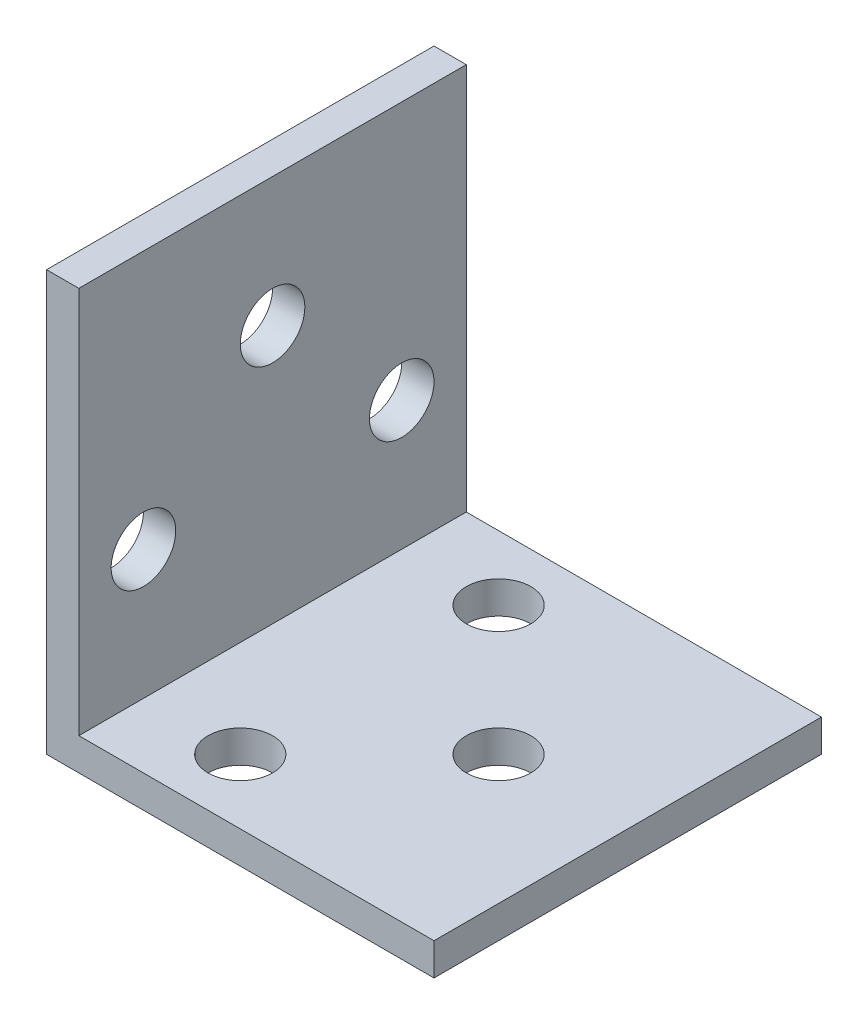
ISO-10303-21;
HEADER;
FILE_DESCRIPTION(('STEP AP214'),'2;1');
FILE_NAME('part.step','',(''),(''),'','','');
FILE_SCHEMA(('AUTOMOTIVE_DESIGN { 1 0 10303 214 1 1 1 1 }'));
ENDSEC;
DATA;
#1=APPLICATION_CONTEXT('core data for automotive mechanical design processes');
#2=APPLICATION_PROTOCOL_DEFINITION('international standard','automotive_design',2000,#1);
#3=PRODUCT_CONTEXT('',#1,'mechanical');
#4=PRODUCT('Part','Part','',(#3));
#5=PRODUCT_RELATED_PRODUCT_CATEGORY('part','',(#4));
#6=PRODUCT_DEFINITION_FORMATION('','',#4);
#7=PRODUCT_DEFINITION_CONTEXT('part definition',#1,'design');
#8=PRODUCT_DEFINITION('design','',#6,#7);
#9=PRODUCT_DEFINITION_SHAPE('','',#8);
#10=(LENGTH_UNIT() NAMED_UNIT(*) SI_UNIT(.MILLI.,.METRE.));
#11=(NAMED_UNIT(*) PLANE_ANGLE_UNIT() SI_UNIT($,.RADIAN.));
#12=(NAMED_UNIT(*) SI_UNIT($,.STERADIAN.) SOLID_ANGLE_UNIT());
#13=UNCERTAINTY_MEASURE_WITH_UNIT(LENGTH_MEASURE(1.E-05),#10,'distance_accuracy_value','');
#14=(GEOMETRIC_REPRESENTATION_CONTEXT(3) GLOBAL_UNCERTAINTY_ASSIGNED_CONTEXT((#13)) GLOBAL_UNIT_ASSIGNED_CONTEXT((#10,
#11,#12)) REPRESENTATION_CONTEXT('',''));
#15=CARTESIAN_POINT('',(0.,0.,0.));
#16=DIRECTION('',(0.,0.,1.));
#17=DIRECTION('',(1.,0.,0.));
#18=AXIS2_PLACEMENT_3D('',#15,#16,#17);
#19=CARTESIAN_POINT('',(3.175,41.275,-38.1));
#20=DIRECTION('',(-1.,0.,0.));
#21=DIRECTION('',(0.,0.,1.));
#22=AXIS2_PLACEMENT_3D('',#19,#20,#21);
#23=PLANE('',#22);
#24=DIRECTION('',(0.,1.,0.));
#25=VECTOR('',#24,1.);
#26=CARTESIAN_POINT('',(3.175,3.175,-38.1));
#27=LINE('',#26,#25);
#28=CARTESIAN_POINT('',(3.175,3.175,-38.1));
#29=VERTEX_POINT('',#28);
#30=CARTESIAN_POINT('',(3.175,41.275,-38.1));
#31=VERTEX_POINT('',#30);
#32=EDGE_CURVE('E93',#29,#31,#27,.T.);
#33=ORIENTED_EDGE('',*,*,#32,.T.);
#34=DIRECTION('',(0.,0.,1.));
#35=VECTOR('',#34,1.);
#36=CARTESIAN_POINT('',(3.175,41.275,0.));
#37=LINE('',#36,#35);
#38=CARTESIAN_POINT('',(3.17500000000001,41.275,0.));
#39=VERTEX_POINT('',#38);
#40=EDGE_CURVE('E204',#39,#31,#37,.F.);
#41=ORIENTED_EDGE('',*,*,#40,.F.);
#42=DIRECTION('',(0.,1.,0.));
#43=VECTOR('',#42,1.);
#44=CARTESIAN_POINT('',(3.175,3.175,0.));
#45=LINE('',#44,#43);
#46=CARTESIAN_POINT('',(3.175,3.175,0.));
#47=VERTEX_POINT('',#46);
#48=EDGE_CURVE('E212',#39,#47,#45,.F.);
#49=ORIENTED_EDGE('',*,*,#48,.T.);
#50=DIRECTION('',(0.,0.,-1.));
#51=VECTOR('',#50,1.);
#52=CARTESIAN_POINT('',(3.175,3.175,0.));
#53=LINE('',#52,#51);
#54=EDGE_CURVE('E66',#47,#29,#53,.T.);
#55=ORIENTED_EDGE('',*,*,#54,.T.);
#56=EDGE_LOOP('',(#33,#41,#49,#55));
#57=FACE_BOUND('',#56,.T.);
#58=CARTESIAN_POINT('',(3.175,15.875,-6.35));
#59=DIRECTION('',(1.,0.,0.));
#60=DIRECTION('',(0.,0.,-1.));
#61=AXIS2_PLACEMENT_3D('',#58,#59,#60);
#62=CIRCLE('',#61,3.175);
#63=CARTESIAN_POINT('',(3.175,15.875,-9.525));
#64=VERTEX_POINT('',#63);
#65=EDGE_CURVE('E98',#64,#64,#62,.F.);
#66=ORIENTED_EDGE('',*,*,#65,.T.);
#67=EDGE_LOOP('',(#66));
#68=FACE_BOUND('',#67,.T.);
#69=CARTESIAN_POINT('',(3.175,15.875,-31.75));
#70=DIRECTION('',(1.,0.,0.));
#71=DIRECTION('',(0.,0.,-1.));
#72=AXIS2_PLACEMENT_3D('',#69,#70,#71);
#73=CIRCLE('',#72,3.175);
#74=CARTESIAN_POINT('',(3.175,15.875,-34.925));
#75=VERTEX_POINT('',#74);
#76=EDGE_CURVE('E101',#75,#75,#73,.F.);
#77=ORIENTED_EDGE('',*,*,#76,.T.);
#78=EDGE_LOOP('',(#77));
#79=FACE_BOUND('',#78,.T.);
#80=CARTESIAN_POINT('',(3.175,28.575,-19.05));
#81=DIRECTION('',(1.,0.,0.));
#82=DIRECTION('',(0.,0.,-1.));
#83=AXIS2_PLACEMENT_3D('',#80,#81,#82);
#84=CIRCLE('',#83,3.175);
#85=CARTESIAN_POINT('',(3.175,28.575,-22.225));
#86=VERTEX_POINT('',#85);
#87=EDGE_CURVE('E83',#86,#86,#84,.F.);
#88=ORIENTED_EDGE('',*,*,#87,.T.);
#89=EDGE_LOOP('',(#88));
#90=FACE_BOUND('',#89,.T.);
#91=ADVANCED_FACE('F17',(#57,#68,#79,#90),#23,.F.);
#92=CARTESIAN_POINT('',(0.,3.175,0.));
#93=DIRECTION('',(0.,-1.,0.));
#94=DIRECTION('',(0.,0.,-1.));
#95=AXIS2_PLACEMENT_3D('',#92,#93,#94);
#96=PLANE('',#95);
#97=DIRECTION('',(-1.,0.,0.));
#98=VECTOR('',#97,1.);
#99=CARTESIAN_POINT('',(0.,3.175,0.));
#100=LINE('',#99,#98);
#101=CARTESIAN_POINT('',(38.1,3.175,0.));
#102=VERTEX_POINT('',#101);
#103=EDGE_CURVE('E78',#47,#102,#100,.F.);
#104=ORIENTED_EDGE('',*,*,#103,.T.);
#105=DIRECTION('',(0.,0.,1.));
#106=VECTOR('',#105,1.);
#107=CARTESIAN_POINT('',(38.1,3.175,0.));
#108=LINE('',#107,#106);
#109=CARTESIAN_POINT('',(38.1,3.175,-38.1));
#110=VERTEX_POINT('',#109);
#111=EDGE_CURVE('E72',#102,#110,#108,.F.);
#112=ORIENTED_EDGE('',*,*,#111,.T.);
#113=DIRECTION('',(1.,0.,0.));
#114=VECTOR('',#113,1.);
#115=CARTESIAN_POINT('',(0.,3.175,-38.1));
#116=LINE('',#115,#114);
#117=EDGE_CURVE('E76',#110,#29,#116,.F.);
#118=ORIENTED_EDGE('',*,*,#117,.T.);
#119=ORIENTED_EDGE('',*,*,#54,.F.);
#120=EDGE_LOOP('',(#104,#112,#118,#119));
#121=FACE_BOUND('',#120,.T.);
#122=CARTESIAN_POINT('',(12.7,3.175,-31.75));
#123=DIRECTION('',(0.,1.,0.));
#124=DIRECTION('',(0.,0.,1.));
#125=AXIS2_PLACEMENT_3D('',#122,#123,#124);
#126=CIRCLE('',#125,3.175);
#127=CARTESIAN_POINT('',(12.7,3.175,-28.575));
#128=VERTEX_POINT('',#127);
#129=EDGE_CURVE('E84',#128,#128,#126,.F.);
#130=ORIENTED_EDGE('',*,*,#129,.T.);
#131=EDGE_LOOP('',(#130));
#132=FACE_BOUND('',#131,.T.);
#133=CARTESIAN_POINT('',(12.7,3.175,-6.35));
#134=DIRECTION('',(0.,1.,0.));
#135=DIRECTION('',(0.,0.,1.));
#136=AXIS2_PLACEMENT_3D('',#133,#134,#135);
#137=CIRCLE('',#136,3.175);
#138=CARTESIAN_POINT('',(12.7,3.175,-3.175));
#139=VERTEX_POINT('',#138);
#140=EDGE_CURVE('E132',#139,#139,#137,.F.);
#141=ORIENTED_EDGE('',*,*,#140,.T.);
#142=EDGE_LOOP('',(#141));
#143=FACE_BOUND('',#142,.T.);
#144=CARTESIAN_POINT('',(25.4,3.175,-19.05));
#145=DIRECTION('',(0.,1.,0.));
#146=DIRECTION('',(0.,0.,1.));
#147=AXIS2_PLACEMENT_3D('',#144,#145,#146);
#148=CIRCLE('',#147,3.175);
#149=CARTESIAN_POINT('',(25.4,3.175,-15.875));
#150=VERTEX_POINT('',#149);
#151=EDGE_CURVE('E20',#150,#150,#148,.F.);
#152=ORIENTED_EDGE('',*,*,#151,.T.);
#153=EDGE_LOOP('',(#152));
#154=FACE_BOUND('',#153,.T.);
#155=ADVANCED_FACE('F74',(#121,#132,#143,#154),#96,.F.);
#156=CARTESIAN_POINT('',(25.4,0.,-19.05));
#157=DIRECTION('',(0.,1.,0.));
#158=DIRECTION('',(0.,0.,1.));
#159=AXIS2_PLACEMENT_3D('',#156,#157,#158);
#160=CYLINDRICAL_SURFACE('',#159,3.175);
#161=ORIENTED_EDGE('',*,*,#151,.F.);
#162=EDGE_LOOP('',(#161));
#163=FACE_BOUND('',#162,.T.);
#164=CARTESIAN_POINT('',(25.4,0.,-19.05));
#165=DIRECTION('',(0.,1.,0.));
#166=DIRECTION('',(0.,0.,1.));
#167=AXIS2_PLACEMENT_3D('',#164,#165,#166);
#168=CIRCLE('',#167,3.175);
#169=CARTESIAN_POINT('',(25.4,0.,-15.875));
#170=VERTEX_POINT('',#169);
#171=EDGE_CURVE('E123',#170,#170,#168,.T.);
#172=ORIENTED_EDGE('',*,*,#171,.F.);
#173=EDGE_LOOP('',(#172));
#174=FACE_BOUND('',#173,.T.);
#175=ADVANCED_FACE('F140',(#163,#174),#160,.F.);
#176=CARTESIAN_POINT('',(12.7,0.,-6.35));
#177=DIRECTION('',(0.,1.,0.));
#178=DIRECTION('',(0.,0.,1.));
#179=AXIS2_PLACEMENT_3D('',#176,#177,#178);
#180=CYLINDRICAL_SURFACE('',#179,3.175);
#181=ORIENTED_EDGE('',*,*,#140,.F.);
#182=EDGE_LOOP('',(#181));
#183=FACE_BOUND('',#182,.T.);
#184=CARTESIAN_POINT('',(12.7,0.,-6.35));
#185=DIRECTION('',(0.,1.,0.));
#186=DIRECTION('',(0.,0.,1.));
#187=AXIS2_PLACEMENT_3D('',#184,#185,#186);
#188=CIRCLE('',#187,3.175);
#189=CARTESIAN_POINT('',(12.7,0.,-3.175));
#190=VERTEX_POINT('',#189);
#191=EDGE_CURVE('E120',#190,#190,#188,.T.);
#192=ORIENTED_EDGE('',*,*,#191,.F.);
#193=EDGE_LOOP('',(#192));
#194=FACE_BOUND('',#193,.T.);
#195=ADVANCED_FACE('F143',(#183,#194),#180,.F.);
#196=CARTESIAN_POINT('',(12.7,0.,-31.75));
#197=DIRECTION('',(0.,1.,0.));
#198=DIRECTION('',(0.,0.,1.));
#199=AXIS2_PLACEMENT_3D('',#196,#197,#198);
#200=CYLINDRICAL_SURFACE('',#199,3.175);
#201=ORIENTED_EDGE('',*,*,#129,.F.);
#202=EDGE_LOOP('',(#201));
#203=FACE_BOUND('',#202,.T.);
#204=CARTESIAN_POINT('',(12.7,0.,-31.75));
#205=DIRECTION('',(0.,1.,0.));
#206=DIRECTION('',(0.,0.,1.));
#207=AXIS2_PLACEMENT_3D('',#204,#205,#206);
#208=CIRCLE('',#207,3.175);
#209=CARTESIAN_POINT('',(12.7,0.,-28.575));
#210=VERTEX_POINT('',#209);
#211=EDGE_CURVE('E116',#210,#210,#208,.T.);
#212=ORIENTED_EDGE('',*,*,#211,.F.);
#213=EDGE_LOOP('',(#212));
#214=FACE_BOUND('',#213,.T.);
#215=ADVANCED_FACE('F183',(#203,#214),#200,.F.);
#216=CARTESIAN_POINT('',(38.1,3.175,0.));
#217=DIRECTION('',(-1.,0.,0.));
#218=DIRECTION('',(0.,0.,1.));
#219=AXIS2_PLACEMENT_3D('',#216,#217,#218);
#220=PLANE('',#219);
#221=DIRECTION('',(0.,1.,0.));
#222=VECTOR('',#221,1.);
#223=CARTESIAN_POINT('',(38.1,3.175,-38.1));
#224=LINE('',#223,#222);
#225=CARTESIAN_POINT('',(38.1,0.,-38.1));
#226=VERTEX_POINT('',#225);
#227=EDGE_CURVE('E90',#226,#110,#224,.T.);
#228=ORIENTED_EDGE('',*,*,#227,.T.);
#229=ORIENTED_EDGE('',*,*,#111,.F.);
#230=DIRECTION('',(0.,1.,0.));
#231=VECTOR('',#230,1.);
#232=CARTESIAN_POINT('',(38.1,3.175,0.));
#233=LINE('',#232,#231);
#234=CARTESIAN_POINT('',(38.1,0.,0.));
#235=VERTEX_POINT('',#234);
#236=EDGE_CURVE('E125',#102,#235,#233,.F.);
#237=ORIENTED_EDGE('',*,*,#236,.T.);
#238=DIRECTION('',(0.,0.,-1.));
#239=VECTOR('',#238,1.);
#240=CARTESIAN_POINT('',(38.1,0.,0.));
#241=LINE('',#240,#239);
#242=EDGE_CURVE('E97',#226,#235,#241,.F.);
#243=ORIENTED_EDGE('',*,*,#242,.F.);
#244=EDGE_LOOP('',(#228,#229,#237,#243));
#245=FACE_BOUND('',#244,.T.);
#246=ADVANCED_FACE('F96',(#245),#220,.F.);
#247=CARTESIAN_POINT('',(0.,28.575,-19.05));
#248=DIRECTION('',(1.,0.,0.));
#249=DIRECTION('',(0.,0.,-1.));
#250=AXIS2_PLACEMENT_3D('',#247,#248,#249);
#251=CYLINDRICAL_SURFACE('',#250,3.175);
#252=CARTESIAN_POINT('',(0.,28.575,-19.05));
#253=DIRECTION('',(1.,0.,0.));
#254=DIRECTION('',(0.,0.,-1.));
#255=AXIS2_PLACEMENT_3D('',#252,#253,#254);
#256=CIRCLE('',#255,3.175);
#257=CARTESIAN_POINT('',(0.,28.575,-22.225));
#258=VERTEX_POINT('',#257);
#259=EDGE_CURVE('E113',#258,#258,#256,.F.);
#260=ORIENTED_EDGE('',*,*,#259,.T.);
#261=EDGE_LOOP('',(#260));
#262=FACE_BOUND('',#261,.T.);
#263=ORIENTED_EDGE('',*,*,#87,.F.);
#264=EDGE_LOOP('',(#263));
#265=FACE_BOUND('',#264,.T.);
#266=ADVANCED_FACE('F176',(#262,#265),#251,.F.);
#267=CARTESIAN_POINT('',(0.,15.875,-31.75));
#268=DIRECTION('',(1.,0.,0.));
#269=DIRECTION('',(0.,0.,-1.));
#270=AXIS2_PLACEMENT_3D('',#267,#268,#269);
#271=CYLINDRICAL_SURFACE('',#270,3.175);
#272=CARTESIAN_POINT('',(0.,15.875,-31.75));
#273=DIRECTION('',(1.,0.,0.));
#274=DIRECTION('',(0.,0.,-1.));
#275=AXIS2_PLACEMENT_3D('',#272,#273,#274);
#276=CIRCLE('',#275,3.175);
#277=CARTESIAN_POINT('',(0.,15.875,-34.925));
#278=VERTEX_POINT('',#277);
#279=EDGE_CURVE('E110',#278,#278,#276,.F.);
#280=ORIENTED_EDGE('',*,*,#279,.T.);
#281=EDGE_LOOP('',(#280));
#282=FACE_BOUND('',#281,.T.);
#283=ORIENTED_EDGE('',*,*,#76,.F.);
#284=EDGE_LOOP('',(#283));
#285=FACE_BOUND('',#284,.T.);
#286=ADVANCED_FACE('F172',(#282,#285),#271,.F.);
#287=CARTESIAN_POINT('',(0.,15.875,-6.35));
#288=DIRECTION('',(1.,0.,0.));
#289=DIRECTION('',(0.,0.,-1.));
#290=AXIS2_PLACEMENT_3D('',#287,#288,#289);
#291=CYLINDRICAL_SURFACE('',#290,3.175);
#292=CARTESIAN_POINT('',(0.,15.875,-6.35));
#293=DIRECTION('',(1.,0.,0.));
#294=DIRECTION('',(0.,0.,-1.));
#295=AXIS2_PLACEMENT_3D('',#292,#293,#294);
#296=CIRCLE('',#295,3.175);
#297=CARTESIAN_POINT('',(0.,15.875,-9.525));
#298=VERTEX_POINT('',#297);
#299=EDGE_CURVE('E106',#298,#298,#296,.F.);
#300=ORIENTED_EDGE('',*,*,#299,.T.);
#301=EDGE_LOOP('',(#300));
#302=FACE_BOUND('',#301,.T.);
#303=ORIENTED_EDGE('',*,*,#65,.F.);
#304=EDGE_LOOP('',(#303));
#305=FACE_BOUND('',#304,.T.);
#306=ADVANCED_FACE('F169',(#302,#305),#291,.F.);
#307=CARTESIAN_POINT('',(0.,3.175,-38.1));
#308=DIRECTION('',(0.,0.,1.));
#309=DIRECTION('',(1.,0.,0.));
#310=AXIS2_PLACEMENT_3D('',#307,#308,#309);
#311=PLANE('',#310);
#312=DIRECTION('',(0.,1.,0.));
#313=VECTOR('',#312,1.);
#314=CARTESIAN_POINT('',(0.,3.175,-38.1));
#315=LINE('',#314,#313);
#316=CARTESIAN_POINT('',(0.,0.,-38.1));
#317=VERTEX_POINT('',#316);
#318=CARTESIAN_POINT('',(0.,41.275,-38.1));
#319=VERTEX_POINT('',#318);
#320=EDGE_CURVE('E109',#317,#319,#315,.T.);
#321=ORIENTED_EDGE('',*,*,#320,.T.);
#322=DIRECTION('',(1.,0.,0.));
#323=VECTOR('',#322,1.);
#324=CARTESIAN_POINT('',(0.,41.275,-38.1));
#325=LINE('',#324,#323);
#326=EDGE_CURVE('E206',#31,#319,#325,.F.);
#327=ORIENTED_EDGE('',*,*,#326,.F.);
#328=ORIENTED_EDGE('',*,*,#32,.F.);
#329=ORIENTED_EDGE('',*,*,#117,.F.);
#330=ORIENTED_EDGE('',*,*,#227,.F.);
#331=DIRECTION('',(1.,0.,0.));
#332=VECTOR('',#331,1.);
#333=CARTESIAN_POINT('',(0.,0.,-38.1));
#334=LINE('',#333,#332);
#335=EDGE_CURVE('E119',#317,#226,#334,.T.);
#336=ORIENTED_EDGE('',*,*,#335,.F.);
#337=EDGE_LOOP('',(#321,#327,#328,#329,#330,#336));
#338=FACE_BOUND('',#337,.T.);
#339=ADVANCED_FACE('F88',(#338),#311,.F.);
#340=CARTESIAN_POINT('',(0.,41.275,0.));
#341=DIRECTION('',(0.,1.,0.));
#342=DIRECTION('',(0.,0.,1.));
#343=AXIS2_PLACEMENT_3D('',#340,#341,#342);
#344=PLANE('',#343);
#345=ORIENTED_EDGE('',*,*,#40,.T.);
#346=ORIENTED_EDGE('',*,*,#326,.T.);
#347=DIRECTION('',(0.,0.,-1.));
#348=VECTOR('',#347,1.);
#349=CARTESIAN_POINT('',(0.,41.275,0.));
#350=LINE('',#349,#348);
#351=CARTESIAN_POINT('',(0.,41.275,0.));
#352=VERTEX_POINT('',#351);
#353=EDGE_CURVE('E223',#319,#352,#350,.F.);
#354=ORIENTED_EDGE('',*,*,#353,.T.);
#355=DIRECTION('',(-1.,0.,0.));
#356=VECTOR('',#355,1.);
#357=CARTESIAN_POINT('',(0.,41.275,0.));
#358=LINE('',#357,#356);
#359=EDGE_CURVE('E209',#352,#39,#358,.F.);
#360=ORIENTED_EDGE('',*,*,#359,.T.);
#361=EDGE_LOOP('',(#345,#346,#354,#360));
#362=FACE_BOUND('',#361,.T.);
#363=ADVANCED_FACE('F159',(#362),#344,.T.);
#364=CARTESIAN_POINT('',(0.,3.175,0.));
#365=DIRECTION('',(0.,0.,-1.));
#366=DIRECTION('',(-1.,0.,0.));
#367=AXIS2_PLACEMENT_3D('',#364,#365,#366);
#368=PLANE('',#367);
#369=ORIENTED_EDGE('',*,*,#236,.F.);
#370=ORIENTED_EDGE('',*,*,#103,.F.);
#371=ORIENTED_EDGE('',*,*,#48,.F.);
#372=ORIENTED_EDGE('',*,*,#359,.F.);
#373=DIRECTION('',(0.,1.,0.));
#374=VECTOR('',#373,1.);
#375=CARTESIAN_POINT('',(0.,3.175,0.));
#376=LINE('',#375,#374);
#377=CARTESIAN_POINT('',(0.,0.,0.));
#378=VERTEX_POINT('',#377);
#379=EDGE_CURVE('E26',#352,#378,#376,.F.);
#380=ORIENTED_EDGE('',*,*,#379,.T.);
#381=DIRECTION('',(1.,0.,0.));
#382=VECTOR('',#381,1.);
#383=CARTESIAN_POINT('',(0.,0.,0.));
#384=LINE('',#383,#382);
#385=EDGE_CURVE('E34',#235,#378,#384,.F.);
#386=ORIENTED_EDGE('',*,*,#385,.F.);
#387=EDGE_LOOP('',(#369,#370,#371,#372,#380,#386));
#388=FACE_BOUND('',#387,.T.);
#389=ADVANCED_FACE('F150',(#388),#368,.F.);
#390=CARTESIAN_POINT('',(0.,0.,0.));
#391=DIRECTION('',(0.,-1.,0.));
#392=DIRECTION('',(0.,0.,-1.));
#393=AXIS2_PLACEMENT_3D('',#390,#391,#392);
#394=PLANE('',#393);
#395=ORIENTED_EDGE('',*,*,#242,.T.);
#396=ORIENTED_EDGE('',*,*,#385,.T.);
#397=DIRECTION('',(0.,0.,-1.));
#398=VECTOR('',#397,1.);
#399=CARTESIAN_POINT('',(0.,0.,0.));
#400=LINE('',#399,#398);
#401=EDGE_CURVE('E11',#378,#317,#400,.T.);
#402=ORIENTED_EDGE('',*,*,#401,.T.);
#403=ORIENTED_EDGE('',*,*,#335,.T.);
#404=EDGE_LOOP('',(#395,#396,#402,#403));
#405=FACE_BOUND('',#404,.T.);
#406=ORIENTED_EDGE('',*,*,#211,.T.);
#407=EDGE_LOOP('',(#406));
#408=FACE_BOUND('',#407,.T.);
#409=ORIENTED_EDGE('',*,*,#191,.T.);
#410=EDGE_LOOP('',(#409));
#411=FACE_BOUND('',#410,.T.);
#412=ORIENTED_EDGE('',*,*,#171,.T.);
#413=EDGE_LOOP('',(#412));
#414=FACE_BOUND('',#413,.T.);
#415=ADVANCED_FACE('F147',(#405,#408,#411,#414),#394,.T.);
#416=CARTESIAN_POINT('',(0.,3.175,0.));
#417=DIRECTION('',(1.,0.,0.));
#418=DIRECTION('',(0.,0.,-1.));
#419=AXIS2_PLACEMENT_3D('',#416,#417,#418);
#420=PLANE('',#419);
#421=ORIENTED_EDGE('',*,*,#379,.F.);
#422=ORIENTED_EDGE('',*,*,#353,.F.);
#423=ORIENTED_EDGE('',*,*,#320,.F.);
#424=ORIENTED_EDGE('',*,*,#401,.F.);
#425=EDGE_LOOP('',(#421,#422,#423,#424));
#426=FACE_BOUND('',#425,.T.);
#427=ORIENTED_EDGE('',*,*,#299,.F.);
#428=EDGE_LOOP('',(#427));
#429=FACE_BOUND('',#428,.T.);
#430=ORIENTED_EDGE('',*,*,#279,.F.);
#431=EDGE_LOOP('',(#430));
#432=FACE_BOUND('',#431,.T.);
#433=ORIENTED_EDGE('',*,*,#259,.F.);
#434=EDGE_LOOP('',(#433));
#435=FACE_BOUND('',#434,.T.);
#436=ADVANCED_FACE('F149',(#426,#429,#432,#435),#420,.F.);
#437=CLOSED_SHELL('',(#91,#155,#175,#195,#215,#246,#266,#286,#306,#339,#363,#389,#415,#436));
#438=MANIFOLD_SOLID_BREP('B1',#437);
#439=ADVANCED_BREP_SHAPE_REPRESENTATION('',(#18,#438),#14);
#440=SHAPE_DEFINITION_REPRESENTATION(#9,#439);
ENDSEC;
END-ISO-10303-21;
